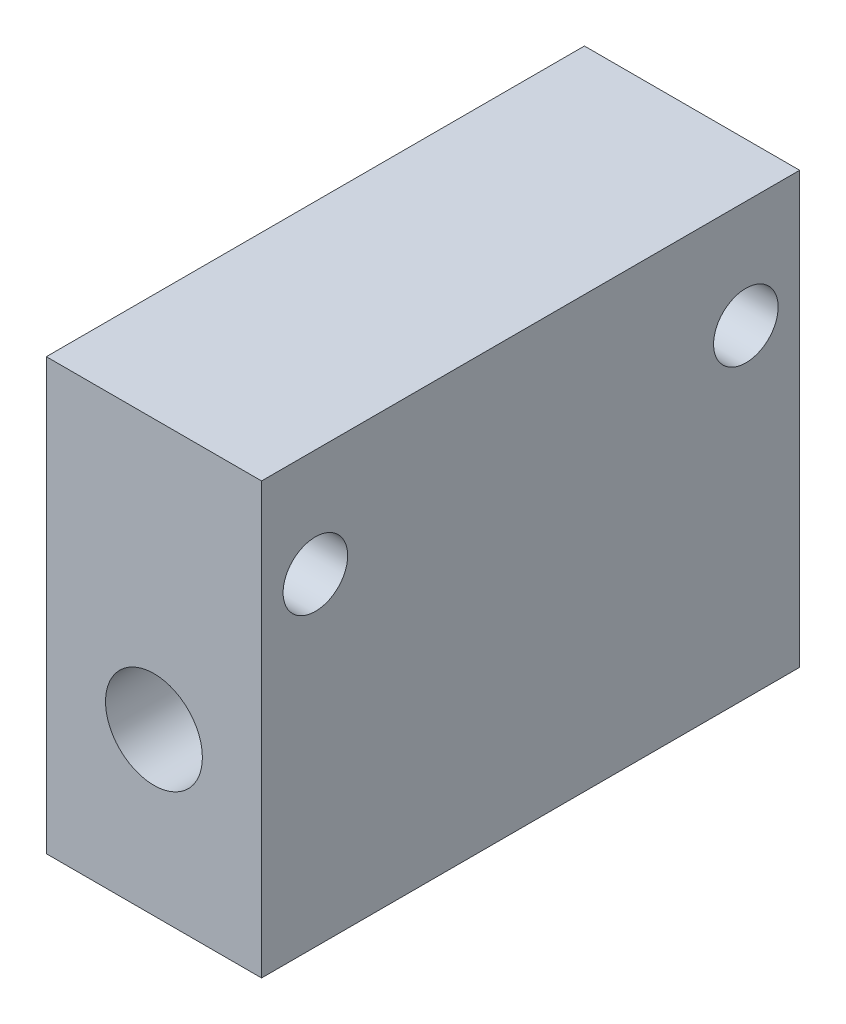
ISO-10303-21;
HEADER;
FILE_DESCRIPTION(('STEP AP214'),'2;1');
FILE_NAME('part.step','',(''),(''),'','','');
FILE_SCHEMA(('AUTOMOTIVE_DESIGN { 1 0 10303 214 1 1 1 1 }'));
ENDSEC;
DATA;
#1=APPLICATION_CONTEXT('core data for automotive mechanical design processes');
#2=APPLICATION_PROTOCOL_DEFINITION('international standard','automotive_design',2000,#1);
#3=PRODUCT_CONTEXT('',#1,'mechanical');
#4=PRODUCT('Part','Part','',(#3));
#5=PRODUCT_RELATED_PRODUCT_CATEGORY('part','',(#4));
#6=PRODUCT_DEFINITION_FORMATION('','',#4);
#7=PRODUCT_DEFINITION_CONTEXT('part definition',#1,'design');
#8=PRODUCT_DEFINITION('design','',#6,#7);
#9=PRODUCT_DEFINITION_SHAPE('','',#8);
#10=(LENGTH_UNIT() NAMED_UNIT(*) SI_UNIT(.MILLI.,.METRE.));
#11=(NAMED_UNIT(*) PLANE_ANGLE_UNIT() SI_UNIT($,.RADIAN.));
#12=(NAMED_UNIT(*) SI_UNIT($,.STERADIAN.) SOLID_ANGLE_UNIT());
#13=UNCERTAINTY_MEASURE_WITH_UNIT(LENGTH_MEASURE(1.E-05),#10,'distance_accuracy_value','');
#14=(GEOMETRIC_REPRESENTATION_CONTEXT(3) GLOBAL_UNCERTAINTY_ASSIGNED_CONTEXT((#13)) GLOBAL_UNIT_ASSIGNED_CONTEXT((#10,
#11,#12)) REPRESENTATION_CONTEXT('',''));
#15=CARTESIAN_POINT('',(0.,0.,0.));
#16=DIRECTION('',(0.,0.,1.));
#17=DIRECTION('',(1.,0.,0.));
#18=AXIS2_PLACEMENT_3D('',#15,#16,#17);
#19=CARTESIAN_POINT('',(-13.8064516129032,40.,-10.2096774193548));
#20=DIRECTION('',(1.,0.,0.));
#21=DIRECTION('',(0.,0.,-1.));
#22=AXIS2_PLACEMENT_3D('',#19,#20,#21);
#23=PLANE('',#22);
#24=CARTESIAN_POINT('',(-13.8064516129032,30.,-5.20967741935483));
#25=DIRECTION('',(1.,0.,0.));
#26=DIRECTION('',(0.,0.,-1.));
#27=AXIS2_PLACEMENT_3D('',#24,#25,#26);
#28=CIRCLE('',#27,3.);
#29=CARTESIAN_POINT('',(-13.8064516129032,30.,-8.20967741935483));
#30=VERTEX_POINT('',#29);
#31=EDGE_CURVE('E120',#30,#30,#28,.T.);
#32=ORIENTED_EDGE('',*,*,#31,.T.);
#33=EDGE_LOOP('',(#32));
#34=FACE_BOUND('',#33,.T.);
#35=CARTESIAN_POINT('',(-13.8064516129032,30.,34.7903225806452));
#36=DIRECTION('',(1.,0.,0.));
#37=DIRECTION('',(0.,0.,-1.));
#38=AXIS2_PLACEMENT_3D('',#35,#36,#37);
#39=CIRCLE('',#38,3.);
#40=CARTESIAN_POINT('',(-13.8064516129032,30.,31.7903225806452));
#41=VERTEX_POINT('',#40);
#42=EDGE_CURVE('E114',#41,#41,#39,.T.);
#43=ORIENTED_EDGE('',*,*,#42,.T.);
#44=EDGE_LOOP('',(#43));
#45=FACE_BOUND('',#44,.T.);
#46=DIRECTION('',(0.,0.,1.));
#47=VECTOR('',#46,1.);
#48=CARTESIAN_POINT('',(-13.8064516129032,0.,-10.2096774193548));
#49=LINE('',#48,#47);
#50=CARTESIAN_POINT('',(-13.8064516129032,0.,-10.2096774193548));
#51=VERTEX_POINT('',#50);
#52=CARTESIAN_POINT('',(-13.8064516129032,0.,39.7903225806452));
#53=VERTEX_POINT('',#52);
#54=EDGE_CURVE('E98',#51,#53,#49,.T.);
#55=ORIENTED_EDGE('',*,*,#54,.T.);
#56=DIRECTION('',(0.,-1.,0.));
#57=VECTOR('',#56,1.);
#58=CARTESIAN_POINT('',(-13.8064516129032,40.,39.7903225806452));
#59=LINE('',#58,#57);
#60=CARTESIAN_POINT('',(-13.8064516129032,40.,39.7903225806452));
#61=VERTEX_POINT('',#60);
#62=EDGE_CURVE('E11',#61,#53,#59,.T.);
#63=ORIENTED_EDGE('',*,*,#62,.F.);
#64=DIRECTION('',(0.,0.,1.));
#65=VECTOR('',#64,1.);
#66=CARTESIAN_POINT('',(-13.8064516129032,40.,-10.2096774193548));
#67=LINE('',#66,#65);
#68=CARTESIAN_POINT('',(-13.8064516129032,40.,-10.2096774193548));
#69=VERTEX_POINT('',#68);
#70=EDGE_CURVE('E85',#69,#61,#67,.T.);
#71=ORIENTED_EDGE('',*,*,#70,.F.);
#72=DIRECTION('',(0.,-1.,0.));
#73=VECTOR('',#72,1.);
#74=CARTESIAN_POINT('',(-13.8064516129032,40.,-10.2096774193548));
#75=LINE('',#74,#73);
#76=EDGE_CURVE('E94',#69,#51,#75,.T.);
#77=ORIENTED_EDGE('',*,*,#76,.T.);
#78=EDGE_LOOP('',(#55,#63,#71,#77));
#79=FACE_BOUND('',#78,.T.);
#80=ADVANCED_FACE('F33',(#34,#45,#79),#23,.F.);
#81=CARTESIAN_POINT('',(-13.8064516129032,40.,39.7903225806452));
#82=DIRECTION('',(0.,0.,-1.));
#83=DIRECTION('',(-1.,0.,0.));
#84=AXIS2_PLACEMENT_3D('',#81,#82,#83);
#85=PLANE('',#84);
#86=CARTESIAN_POINT('',(-3.80645161290322,15.,39.7903225806452));
#87=DIRECTION('',(0.,0.,1.));
#88=DIRECTION('',(1.,0.,0.));
#89=AXIS2_PLACEMENT_3D('',#86,#87,#88);
#90=CIRCLE('',#89,4.5);
#91=CARTESIAN_POINT('',(0.693548387096778,15.,39.7903225806452));
#92=VERTEX_POINT('',#91);
#93=EDGE_CURVE('E111',#92,#92,#90,.T.);
#94=ORIENTED_EDGE('',*,*,#93,.F.);
#95=EDGE_LOOP('',(#94));
#96=FACE_BOUND('',#95,.T.);
#97=DIRECTION('',(1.,0.,0.));
#98=VECTOR('',#97,1.);
#99=CARTESIAN_POINT('',(-13.8064516129032,0.,39.7903225806452));
#100=LINE('',#99,#98);
#101=CARTESIAN_POINT('',(6.19354838709678,0.,39.7903225806452));
#102=VERTEX_POINT('',#101);
#103=EDGE_CURVE('E89',#53,#102,#100,.T.);
#104=ORIENTED_EDGE('',*,*,#103,.T.);
#105=DIRECTION('',(0.,-1.,0.));
#106=VECTOR('',#105,1.);
#107=CARTESIAN_POINT('',(6.19354838709678,40.,39.7903225806452));
#108=LINE('',#107,#106);
#109=CARTESIAN_POINT('',(6.19354838709678,40.,39.7903225806452));
#110=VERTEX_POINT('',#109);
#111=EDGE_CURVE('E42',#110,#102,#108,.T.);
#112=ORIENTED_EDGE('',*,*,#111,.F.);
#113=DIRECTION('',(1.,0.,0.));
#114=VECTOR('',#113,1.);
#115=CARTESIAN_POINT('',(-13.8064516129032,40.,39.7903225806452));
#116=LINE('',#115,#114);
#117=EDGE_CURVE('E80',#61,#110,#116,.T.);
#118=ORIENTED_EDGE('',*,*,#117,.F.);
#119=ORIENTED_EDGE('',*,*,#62,.T.);
#120=EDGE_LOOP('',(#104,#112,#118,#119));
#121=FACE_BOUND('',#120,.T.);
#122=ADVANCED_FACE('F88',(#96,#121),#85,.F.);
#123=CARTESIAN_POINT('',(6.19354838709677,40.,-10.2096774193548));
#124=DIRECTION('',(-1.,0.,0.));
#125=DIRECTION('',(0.,0.,1.));
#126=AXIS2_PLACEMENT_3D('',#123,#124,#125);
#127=PLANE('',#126);
#128=CARTESIAN_POINT('',(6.19354838709677,30.,-5.20967741935483));
#129=DIRECTION('',(1.,0.,0.));
#130=DIRECTION('',(0.,0.,-1.));
#131=AXIS2_PLACEMENT_3D('',#128,#129,#130);
#132=CIRCLE('',#131,3.);
#133=CARTESIAN_POINT('',(6.19354838709677,30.,-8.20967741935483));
#134=VERTEX_POINT('',#133);
#135=EDGE_CURVE('E123',#134,#134,#132,.T.);
#136=ORIENTED_EDGE('',*,*,#135,.F.);
#137=EDGE_LOOP('',(#136));
#138=FACE_BOUND('',#137,.T.);
#139=CARTESIAN_POINT('',(6.19354838709678,30.,34.7903225806452));
#140=DIRECTION('',(1.,0.,0.));
#141=DIRECTION('',(0.,0.,-1.));
#142=AXIS2_PLACEMENT_3D('',#139,#140,#141);
#143=CIRCLE('',#142,3.);
#144=CARTESIAN_POINT('',(6.19354838709678,30.,31.7903225806452));
#145=VERTEX_POINT('',#144);
#146=EDGE_CURVE('E117',#145,#145,#143,.T.);
#147=ORIENTED_EDGE('',*,*,#146,.F.);
#148=EDGE_LOOP('',(#147));
#149=FACE_BOUND('',#148,.T.);
#150=DIRECTION('',(0.,0.,-1.));
#151=VECTOR('',#150,1.);
#152=CARTESIAN_POINT('',(6.19354838709677,0.,-10.2096774193548));
#153=LINE('',#152,#151);
#154=CARTESIAN_POINT('',(6.19354838709677,0.,-10.2096774193548));
#155=VERTEX_POINT('',#154);
#156=EDGE_CURVE('E67',#102,#155,#153,.T.);
#157=ORIENTED_EDGE('',*,*,#156,.T.);
#158=DIRECTION('',(0.,-1.,0.));
#159=VECTOR('',#158,1.);
#160=CARTESIAN_POINT('',(6.19354838709677,40.,-10.2096774193548));
#161=LINE('',#160,#159);
#162=CARTESIAN_POINT('',(6.19354838709677,40.,-10.2096774193548));
#163=VERTEX_POINT('',#162);
#164=EDGE_CURVE('E90',#163,#155,#161,.T.);
#165=ORIENTED_EDGE('',*,*,#164,.F.);
#166=DIRECTION('',(0.,0.,-1.));
#167=VECTOR('',#166,1.);
#168=CARTESIAN_POINT('',(6.19354838709677,40.,-10.2096774193548));
#169=LINE('',#168,#167);
#170=EDGE_CURVE('E83',#110,#163,#169,.T.);
#171=ORIENTED_EDGE('',*,*,#170,.F.);
#172=ORIENTED_EDGE('',*,*,#111,.T.);
#173=EDGE_LOOP('',(#157,#165,#171,#172));
#174=FACE_BOUND('',#173,.T.);
#175=ADVANCED_FACE('F92',(#138,#149,#174),#127,.F.);
#176=CARTESIAN_POINT('',(-13.8064516129032,40.,-10.2096774193548));
#177=DIRECTION('',(0.,0.,1.));
#178=DIRECTION('',(1.,0.,0.));
#179=AXIS2_PLACEMENT_3D('',#176,#177,#178);
#180=PLANE('',#179);
#181=CARTESIAN_POINT('',(-3.80645161290322,15.,-10.2096774193548));
#182=DIRECTION('',(0.,0.,1.));
#183=DIRECTION('',(1.,0.,0.));
#184=AXIS2_PLACEMENT_3D('',#181,#182,#183);
#185=CIRCLE('',#184,4.5);
#186=CARTESIAN_POINT('',(0.693548387096778,15.,-10.2096774193548));
#187=VERTEX_POINT('',#186);
#188=EDGE_CURVE('E36',#187,#187,#185,.T.);
#189=ORIENTED_EDGE('',*,*,#188,.T.);
#190=EDGE_LOOP('',(#189));
#191=FACE_BOUND('',#190,.T.);
#192=DIRECTION('',(-1.,0.,0.));
#193=VECTOR('',#192,1.);
#194=CARTESIAN_POINT('',(-13.8064516129032,0.,-10.2096774193548));
#195=LINE('',#194,#193);
#196=EDGE_CURVE('E73',#155,#51,#195,.T.);
#197=ORIENTED_EDGE('',*,*,#196,.T.);
#198=ORIENTED_EDGE('',*,*,#76,.F.);
#199=DIRECTION('',(-1.,0.,0.));
#200=VECTOR('',#199,1.);
#201=CARTESIAN_POINT('',(-13.8064516129032,40.,-10.2096774193548));
#202=LINE('',#201,#200);
#203=EDGE_CURVE('E50',#163,#69,#202,.T.);
#204=ORIENTED_EDGE('',*,*,#203,.F.);
#205=ORIENTED_EDGE('',*,*,#164,.T.);
#206=EDGE_LOOP('',(#197,#198,#204,#205));
#207=FACE_BOUND('',#206,.T.);
#208=ADVANCED_FACE('F105',(#191,#207),#180,.F.);
#209=CARTESIAN_POINT('',(0.,40.,0.));
#210=DIRECTION('',(0.,1.,0.));
#211=DIRECTION('',(0.,0.,1.));
#212=AXIS2_PLACEMENT_3D('',#209,#210,#211);
#213=PLANE('',#212);
#214=ORIENTED_EDGE('',*,*,#70,.T.);
#215=ORIENTED_EDGE('',*,*,#117,.T.);
#216=ORIENTED_EDGE('',*,*,#170,.T.);
#217=ORIENTED_EDGE('',*,*,#203,.T.);
#218=EDGE_LOOP('',(#214,#215,#216,#217));
#219=FACE_BOUND('',#218,.T.);
#220=ADVANCED_FACE('F81',(#219),#213,.T.);
#221=CARTESIAN_POINT('',(0.,0.,0.));
#222=DIRECTION('',(0.,1.,0.));
#223=DIRECTION('',(0.,0.,1.));
#224=AXIS2_PLACEMENT_3D('',#221,#222,#223);
#225=PLANE('',#224);
#226=ORIENTED_EDGE('',*,*,#54,.F.);
#227=ORIENTED_EDGE('',*,*,#196,.F.);
#228=ORIENTED_EDGE('',*,*,#156,.F.);
#229=ORIENTED_EDGE('',*,*,#103,.F.);
#230=EDGE_LOOP('',(#226,#227,#228,#229));
#231=FACE_BOUND('',#230,.T.);
#232=ADVANCED_FACE('F108',(#231),#225,.F.);
#233=CARTESIAN_POINT('',(-3.80645161290322,15.,-20.2096774193548));
#234=DIRECTION('',(0.,0.,1.));
#235=DIRECTION('',(1.,0.,0.));
#236=AXIS2_PLACEMENT_3D('',#233,#234,#235);
#237=CYLINDRICAL_SURFACE('',#236,4.5);
#238=ORIENTED_EDGE('',*,*,#93,.T.);
#239=EDGE_LOOP('',(#238));
#240=FACE_BOUND('',#239,.T.);
#241=ORIENTED_EDGE('',*,*,#188,.F.);
#242=EDGE_LOOP('',(#241));
#243=FACE_BOUND('',#242,.T.);
#244=ADVANCED_FACE('F138',(#240,#243),#237,.F.);
#245=CARTESIAN_POINT('',(-53.8064516129032,30.,34.7903225806452));
#246=DIRECTION('',(1.,0.,0.));
#247=DIRECTION('',(0.,0.,-1.));
#248=AXIS2_PLACEMENT_3D('',#245,#246,#247);
#249=CYLINDRICAL_SURFACE('',#248,3.);
#250=ORIENTED_EDGE('',*,*,#146,.T.);
#251=EDGE_LOOP('',(#250));
#252=FACE_BOUND('',#251,.T.);
#253=ORIENTED_EDGE('',*,*,#42,.F.);
#254=EDGE_LOOP('',(#253));
#255=FACE_BOUND('',#254,.T.);
#256=ADVANCED_FACE('F135',(#252,#255),#249,.F.);
#257=CARTESIAN_POINT('',(-53.8064516129032,30.,-5.20967741935483));
#258=DIRECTION('',(1.,0.,0.));
#259=DIRECTION('',(0.,0.,-1.));
#260=AXIS2_PLACEMENT_3D('',#257,#258,#259);
#261=CYLINDRICAL_SURFACE('',#260,3.);
#262=ORIENTED_EDGE('',*,*,#135,.T.);
#263=EDGE_LOOP('',(#262));
#264=FACE_BOUND('',#263,.T.);
#265=ORIENTED_EDGE('',*,*,#31,.F.);
#266=EDGE_LOOP('',(#265));
#267=FACE_BOUND('',#266,.T.);
#268=ADVANCED_FACE('F127',(#264,#267),#261,.F.);
#269=CLOSED_SHELL('',(#80,#122,#175,#208,#220,#232,#244,#256,#268));
#270=MANIFOLD_SOLID_BREP('B2',#269);
#271=ADVANCED_BREP_SHAPE_REPRESENTATION('',(#18,#270),#14);
#272=SHAPE_DEFINITION_REPRESENTATION(#9,#271);
ENDSEC;
END-ISO-10303-21;
